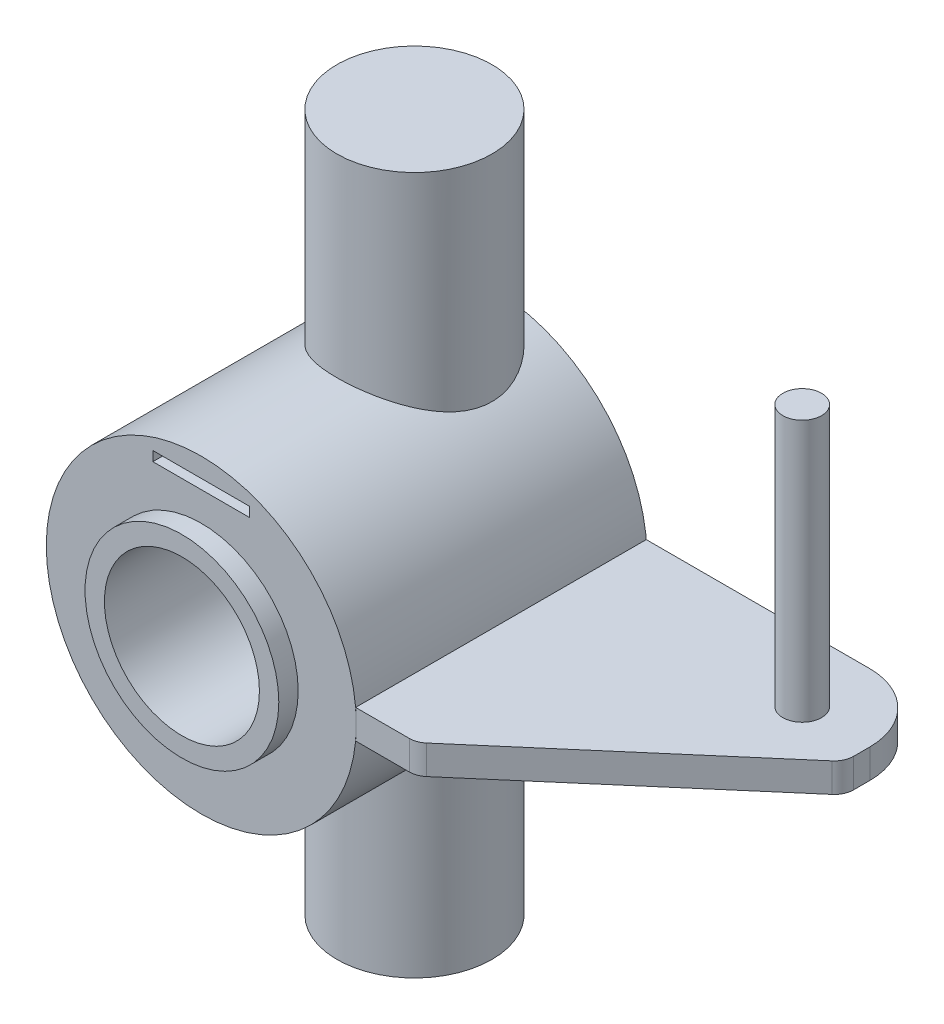
ISO-10303-21;
HEADER;
FILE_DESCRIPTION(('STEP AP214'),'2;1');
FILE_NAME('part.step','',(''),(''),'','','');
FILE_SCHEMA(('AUTOMOTIVE_DESIGN { 1 0 10303 214 1 1 1 1 }'));
ENDSEC;
DATA;
#1=APPLICATION_CONTEXT('core data for automotive mechanical design processes');
#2=APPLICATION_PROTOCOL_DEFINITION('international standard','automotive_design',2000,#1);
#3=PRODUCT_CONTEXT('',#1,'mechanical');
#4=PRODUCT('Part','Part','',(#3));
#5=PRODUCT_RELATED_PRODUCT_CATEGORY('part','',(#4));
#6=PRODUCT_DEFINITION_FORMATION('','',#4);
#7=PRODUCT_DEFINITION_CONTEXT('part definition',#1,'design');
#8=PRODUCT_DEFINITION('design','',#6,#7);
#9=PRODUCT_DEFINITION_SHAPE('','',#8);
#10=(LENGTH_UNIT() NAMED_UNIT(*) SI_UNIT(.MILLI.,.METRE.));
#11=(NAMED_UNIT(*) PLANE_ANGLE_UNIT() SI_UNIT($,.RADIAN.));
#12=(NAMED_UNIT(*) SI_UNIT($,.STERADIAN.) SOLID_ANGLE_UNIT());
#13=UNCERTAINTY_MEASURE_WITH_UNIT(LENGTH_MEASURE(1.E-05),#10,'distance_accuracy_value','');
#14=(GEOMETRIC_REPRESENTATION_CONTEXT(3) GLOBAL_UNCERTAINTY_ASSIGNED_CONTEXT((#13)) GLOBAL_UNIT_ASSIGNED_CONTEXT((#10,
#11,#12)) REPRESENTATION_CONTEXT('',''));
#15=CARTESIAN_POINT('',(0.,0.,0.));
#16=DIRECTION('',(0.,0.,1.));
#17=DIRECTION('',(1.,0.,0.));
#18=AXIS2_PLACEMENT_3D('',#15,#16,#17);
#19=CARTESIAN_POINT('',(23.,0.750000000000004,0.));
#20=DIRECTION('',(0.,-1.,0.));
#21=DIRECTION('',(0.,0.,-1.));
#22=AXIS2_PLACEMENT_3D('',#19,#20,#21);
#23=PLANE('',#22);
#24=CARTESIAN_POINT('',(19.4463189334762,0.750000000000002,3.43499495567666));
#25=DIRECTION('',(0.,-1.,0.));
#26=DIRECTION('',(0.,0.,-1.));
#27=AXIS2_PLACEMENT_3D('',#24,#25,#26);
#28=CIRCLE('',#27,1.);
#29=CARTESIAN_POINT('',(19.4463189334762,0.750000000000003,2.43499495567666));
#30=VERTEX_POINT('',#29);
#31=EDGE_CURVE('E168',#30,#30,#28,.T.);
#32=ORIENTED_EDGE('',*,*,#31,.T.);
#33=EDGE_LOOP('',(#32));
#34=FACE_BOUND('',#33,.T.);
#35=DIRECTION('',(0.758813097039512,0.,-0.651308439805062));
#36=VECTOR('',#35,1.);
#37=CARTESIAN_POINT('',(25.3687248158512,0.750000000000003,2.75970539256084));
#38=LINE('',#37,#36);
#39=CARTESIAN_POINT('',(11.3890501755666,0.749999999999998,14.7588130970395));
#40=VERTEX_POINT('',#39);
#41=CARTESIAN_POINT('',(22.6513084398051,0.750000000000002,5.09213247781868));
#42=VERTEX_POINT('',#41);
#43=EDGE_CURVE('E116',#40,#42,#38,.T.);
#44=ORIENTED_EDGE('',*,*,#43,.T.);
#45=CARTESIAN_POINT('',(22.,0.750000000000002,4.33331938077917));
#46=DIRECTION('',(0.,-1.,0.));
#47=DIRECTION('',(0.,0.,-1.));
#48=AXIS2_PLACEMENT_3D('',#45,#46,#47);
#49=CIRCLE('',#48,1.);
#50=CARTESIAN_POINT('',(23.,0.750000000000002,4.33331938077917));
#51=VERTEX_POINT('',#50);
#52=EDGE_CURVE('E65',#42,#51,#49,.F.);
#53=ORIENTED_EDGE('',*,*,#52,.T.);
#54=DIRECTION('',(0.,0.,1.));
#55=VECTOR('',#54,1.);
#56=CARTESIAN_POINT('',(23.,0.750000000000004,0.));
#57=LINE('',#56,#55);
#58=CARTESIAN_POINT('',(23.,0.750000000000002,3.5));
#59=VERTEX_POINT('',#58);
#60=EDGE_CURVE('E136',#59,#51,#57,.T.);
#61=ORIENTED_EDGE('',*,*,#60,.F.);
#62=CARTESIAN_POINT('',(19.5,0.750000000000002,3.5));
#63=DIRECTION('',(0.,-1.,0.));
#64=DIRECTION('',(0.,0.,-1.));
#65=AXIS2_PLACEMENT_3D('',#62,#63,#64);
#66=CIRCLE('',#65,3.5);
#67=CARTESIAN_POINT('',(19.5,0.750000000000004,0.));
#68=VERTEX_POINT('',#67);
#69=EDGE_CURVE('E125',#68,#59,#66,.T.);
#70=ORIENTED_EDGE('',*,*,#69,.F.);
#71=DIRECTION('',(-1.,0.,0.));
#72=VECTOR('',#71,1.);
#73=CARTESIAN_POINT('',(23.,0.750000000000004,0.));
#74=LINE('',#73,#72);
#75=CARTESIAN_POINT('',(7.964766161037,0.749999999999998,0.));
#76=VERTEX_POINT('',#75);
#77=EDGE_CURVE('E124',#68,#76,#74,.T.);
#78=ORIENTED_EDGE('',*,*,#77,.T.);
#79=DIRECTION('',(0.,0.,-1.));
#80=VECTOR('',#79,1.);
#81=CARTESIAN_POINT('',(7.964766161037,0.749999999999998,15.));
#82=LINE('',#81,#80);
#83=CARTESIAN_POINT('',(7.964766161037,0.749999999999998,15.));
#84=VERTEX_POINT('',#83);
#85=EDGE_CURVE('E175',#76,#84,#82,.F.);
#86=ORIENTED_EDGE('',*,*,#85,.T.);
#87=DIRECTION('',(-1.,0.,0.));
#88=VECTOR('',#87,1.);
#89=CARTESIAN_POINT('',(23.,0.749999999999998,15.));
#90=LINE('',#89,#88);
#91=CARTESIAN_POINT('',(10.7377417357616,0.749999999999998,15.));
#92=VERTEX_POINT('',#91);
#93=EDGE_CURVE('E134',#92,#84,#90,.T.);
#94=ORIENTED_EDGE('',*,*,#93,.F.);
#95=CARTESIAN_POINT('',(10.7377417357616,0.749999999999999,14.));
#96=DIRECTION('',(0.,-1.,0.));
#97=DIRECTION('',(0.,0.,-1.));
#98=AXIS2_PLACEMENT_3D('',#95,#96,#97);
#99=CIRCLE('',#98,1.);
#100=EDGE_CURVE('E150',#92,#40,#99,.F.);
#101=ORIENTED_EDGE('',*,*,#100,.T.);
#102=EDGE_LOOP('',(#44,#53,#61,#70,#78,#86,#94,#101));
#103=FACE_BOUND('',#102,.T.);
#104=ADVANCED_FACE('F43',(#34,#103),#23,.F.);
#105=CARTESIAN_POINT('',(23.,-0.750000000000004,0.));
#106=DIRECTION('',(0.,1.,0.));
#107=DIRECTION('',(0.,0.,1.));
#108=AXIS2_PLACEMENT_3D('',#105,#106,#107);
#109=PLANE('',#108);
#110=DIRECTION('',(0.,0.,-1.));
#111=VECTOR('',#110,1.);
#112=CARTESIAN_POINT('',(23.,-0.750000000000004,0.));
#113=LINE('',#112,#111);
#114=CARTESIAN_POINT('',(23.,-0.750000000000003,4.33331938077917));
#115=VERTEX_POINT('',#114);
#116=CARTESIAN_POINT('',(23.,-0.750000000000003,3.5));
#117=VERTEX_POINT('',#116);
#118=EDGE_CURVE('E132',#115,#117,#113,.T.);
#119=ORIENTED_EDGE('',*,*,#118,.F.);
#120=CARTESIAN_POINT('',(22.,-0.750000000000004,4.33331938077917));
#121=DIRECTION('',(0.,1.,0.));
#122=DIRECTION('',(0.,0.,1.));
#123=AXIS2_PLACEMENT_3D('',#120,#121,#122);
#124=CIRCLE('',#123,1.);
#125=CARTESIAN_POINT('',(22.6513084398051,-0.750000000000003,5.09213247781868));
#126=VERTEX_POINT('',#125);
#127=EDGE_CURVE('E12',#115,#126,#124,.F.);
#128=ORIENTED_EDGE('',*,*,#127,.T.);
#129=DIRECTION('',(0.758813097039512,0.,-0.651308439805062));
#130=VECTOR('',#129,1.);
#131=CARTESIAN_POINT('',(12.1253865423612,-0.750000000000002,14.1267970022992));
#132=LINE('',#131,#130);
#133=CARTESIAN_POINT('',(11.3890501755666,-0.750000000000002,14.7588130970395));
#134=VERTEX_POINT('',#133);
#135=EDGE_CURVE('E162',#134,#126,#132,.T.);
#136=ORIENTED_EDGE('',*,*,#135,.F.);
#137=CARTESIAN_POINT('',(10.7377417357616,-0.750000000000002,14.));
#138=DIRECTION('',(0.,1.,0.));
#139=DIRECTION('',(0.,0.,1.));
#140=AXIS2_PLACEMENT_3D('',#137,#138,#139);
#141=CIRCLE('',#140,1.);
#142=CARTESIAN_POINT('',(10.7377417357616,-0.750000000000002,15.));
#143=VERTEX_POINT('',#142);
#144=EDGE_CURVE('E146',#134,#143,#141,.F.);
#145=ORIENTED_EDGE('',*,*,#144,.T.);
#146=DIRECTION('',(-1.,0.,0.));
#147=VECTOR('',#146,1.);
#148=CARTESIAN_POINT('',(23.,-0.750000000000002,15.));
#149=LINE('',#148,#147);
#150=CARTESIAN_POINT('',(7.964766161037,-0.750000000000002,15.));
#151=VERTEX_POINT('',#150);
#152=EDGE_CURVE('E131',#143,#151,#149,.T.);
#153=ORIENTED_EDGE('',*,*,#152,.T.);
#154=DIRECTION('',(0.,0.,-1.));
#155=VECTOR('',#154,1.);
#156=CARTESIAN_POINT('',(7.96476616103699,-0.750000000000002,15.));
#157=LINE('',#156,#155);
#158=CARTESIAN_POINT('',(7.964766161037,-0.750000000000002,0.));
#159=VERTEX_POINT('',#158);
#160=EDGE_CURVE('E130',#151,#159,#157,.T.);
#161=ORIENTED_EDGE('',*,*,#160,.T.);
#162=DIRECTION('',(-1.,0.,0.));
#163=VECTOR('',#162,1.);
#164=CARTESIAN_POINT('',(23.,-0.750000000000004,0.));
#165=LINE('',#164,#163);
#166=CARTESIAN_POINT('',(19.5,-0.750000000000004,0.));
#167=VERTEX_POINT('',#166);
#168=EDGE_CURVE('E122',#167,#159,#165,.T.);
#169=ORIENTED_EDGE('',*,*,#168,.F.);
#170=CARTESIAN_POINT('',(19.5,-0.750000000000003,3.5));
#171=DIRECTION('',(0.,-1.,0.));
#172=DIRECTION('',(0.,0.,-1.));
#173=AXIS2_PLACEMENT_3D('',#170,#171,#172);
#174=CIRCLE('',#173,3.5);
#175=EDGE_CURVE('E107',#167,#117,#174,.T.);
#176=ORIENTED_EDGE('',*,*,#175,.T.);
#177=EDGE_LOOP('',(#119,#128,#136,#145,#153,#161,#169,#176));
#178=FACE_BOUND('',#177,.T.);
#179=ADVANCED_FACE('F128',(#178),#109,.F.);
#180=CARTESIAN_POINT('',(23.,-0.750000000000004,0.));
#181=DIRECTION('',(0.,0.,1.));
#182=DIRECTION('',(0.,-1.,0.));
#183=AXIS2_PLACEMENT_3D('',#180,#181,#182);
#184=PLANE('',#183);
#185=ORIENTED_EDGE('',*,*,#77,.F.);
#186=DIRECTION('',(0.,-1.,0.));
#187=VECTOR('',#186,1.);
#188=CARTESIAN_POINT('',(19.5,14.25,0.));
#189=LINE('',#188,#187);
#190=EDGE_CURVE('E110',#68,#167,#189,.T.);
#191=ORIENTED_EDGE('',*,*,#190,.T.);
#192=ORIENTED_EDGE('',*,*,#168,.T.);
#193=CARTESIAN_POINT('',(0.,0.,0.));
#194=DIRECTION('',(0.,0.,-1.));
#195=DIRECTION('',(0.,1.,0.));
#196=AXIS2_PLACEMENT_3D('',#193,#194,#195);
#197=CIRCLE('',#196,8.);
#198=EDGE_CURVE('E174',#159,#76,#197,.F.);
#199=ORIENTED_EDGE('',*,*,#198,.T.);
#200=EDGE_LOOP('',(#185,#191,#192,#199));
#201=FACE_BOUND('',#200,.T.);
#202=ADVANCED_FACE('F120',(#201),#184,.F.);
#203=CARTESIAN_POINT('',(23.,-0.750000000000002,15.));
#204=DIRECTION('',(0.,0.,-1.));
#205=DIRECTION('',(-1.,0.,0.));
#206=AXIS2_PLACEMENT_3D('',#203,#204,#205);
#207=PLANE('',#206);
#208=ORIENTED_EDGE('',*,*,#152,.F.);
#209=DIRECTION('',(0.,-1.,0.));
#210=VECTOR('',#209,1.);
#211=CARTESIAN_POINT('',(10.7377417357616,-0.750000000000004,15.));
#212=LINE('',#211,#210);
#213=EDGE_CURVE('E148',#143,#92,#212,.F.);
#214=ORIENTED_EDGE('',*,*,#213,.T.);
#215=ORIENTED_EDGE('',*,*,#93,.T.);
#216=CARTESIAN_POINT('',(0.,0.,15.));
#217=DIRECTION('',(0.,0.,1.));
#218=DIRECTION('',(1.,0.,0.));
#219=AXIS2_PLACEMENT_3D('',#216,#217,#218);
#220=CIRCLE('',#219,8.);
#221=EDGE_CURVE('E178',#84,#151,#220,.F.);
#222=ORIENTED_EDGE('',*,*,#221,.T.);
#223=EDGE_LOOP('',(#208,#214,#215,#222));
#224=FACE_BOUND('',#223,.T.);
#225=ADVANCED_FACE('F186',(#224),#207,.F.);
#226=CARTESIAN_POINT('',(23.,0.,0.));
#227=DIRECTION('',(1.,0.,0.));
#228=DIRECTION('',(0.,0.,-1.));
#229=AXIS2_PLACEMENT_3D('',#226,#227,#228);
#230=PLANE('',#229);
#231=ORIENTED_EDGE('',*,*,#60,.T.);
#232=DIRECTION('',(0.,1.,0.));
#233=VECTOR('',#232,1.);
#234=CARTESIAN_POINT('',(23.,-0.750000000000002,4.33331938077917));
#235=LINE('',#234,#233);
#236=EDGE_CURVE('E51',#51,#115,#235,.F.);
#237=ORIENTED_EDGE('',*,*,#236,.T.);
#238=ORIENTED_EDGE('',*,*,#118,.T.);
#239=DIRECTION('',(0.,-1.,0.));
#240=VECTOR('',#239,1.);
#241=CARTESIAN_POINT('',(23.,14.25,3.5));
#242=LINE('',#241,#240);
#243=EDGE_CURVE('E113',#59,#117,#242,.T.);
#244=ORIENTED_EDGE('',*,*,#243,.F.);
#245=EDGE_LOOP('',(#231,#237,#238,#244));
#246=FACE_BOUND('',#245,.T.);
#247=ADVANCED_FACE('F181',(#246),#230,.T.);
#248=CARTESIAN_POINT('',(0.,0.,15.));
#249=DIRECTION('',(0.,0.,-1.));
#250=DIRECTION('',(-1.,0.,0.));
#251=AXIS2_PLACEMENT_3D('',#248,#249,#250);
#252=CYLINDRICAL_SURFACE('',#251,8.);
#253=ORIENTED_EDGE('',*,*,#198,.F.);
#254=ORIENTED_EDGE('',*,*,#160,.F.);
#255=ORIENTED_EDGE('',*,*,#221,.F.);
#256=ORIENTED_EDGE('',*,*,#85,.F.);
#257=EDGE_LOOP('',(#253,#254,#255,#256));
#258=FACE_BOUND('',#257,.T.);
#259=ADVANCED_FACE('F213',(#258),#252,.F.);
#260=CARTESIAN_POINT('',(19.5,14.25,3.5));
#261=DIRECTION('',(0.,-1.,0.));
#262=DIRECTION('',(0.,0.,-1.));
#263=AXIS2_PLACEMENT_3D('',#260,#261,#262);
#264=CYLINDRICAL_SURFACE('',#263,3.5);
#265=ORIENTED_EDGE('',*,*,#69,.T.);
#266=ORIENTED_EDGE('',*,*,#243,.T.);
#267=ORIENTED_EDGE('',*,*,#175,.F.);
#268=ORIENTED_EDGE('',*,*,#190,.F.);
#269=EDGE_LOOP('',(#265,#266,#267,#268));
#270=FACE_BOUND('',#269,.T.);
#271=ADVANCED_FACE('F109',(#270),#264,.T.);
#272=CARTESIAN_POINT('',(12.1253865423612,14.25,14.1267970022992));
#273=DIRECTION('',(-0.651308439805062,0.,-0.758813097039512));
#274=DIRECTION('',(-0.758813097039512,0.,0.651308439805062));
#275=AXIS2_PLACEMENT_3D('',#272,#273,#274);
#276=PLANE('',#275);
#277=ORIENTED_EDGE('',*,*,#135,.T.);
#278=DIRECTION('',(0.,1.,0.));
#279=VECTOR('',#278,1.);
#280=CARTESIAN_POINT('',(22.6513084398051,0.750000000000003,5.09213247781868));
#281=LINE('',#280,#279);
#282=EDGE_CURVE('E152',#126,#42,#281,.T.);
#283=ORIENTED_EDGE('',*,*,#282,.T.);
#284=ORIENTED_EDGE('',*,*,#43,.F.);
#285=DIRECTION('',(0.,-1.,0.));
#286=VECTOR('',#285,1.);
#287=CARTESIAN_POINT('',(11.3890501755666,14.25,14.7588130970395));
#288=LINE('',#287,#286);
#289=EDGE_CURVE('E143',#40,#134,#288,.T.);
#290=ORIENTED_EDGE('',*,*,#289,.T.);
#291=EDGE_LOOP('',(#277,#283,#284,#290));
#292=FACE_BOUND('',#291,.T.);
#293=ADVANCED_FACE('F159',(#292),#276,.F.);
#294=CARTESIAN_POINT('',(10.7377417357616,14.25,14.));
#295=DIRECTION('',(0.,-1.,0.));
#296=DIRECTION('',(1.,0.,0.));
#297=AXIS2_PLACEMENT_3D('',#294,#295,#296);
#298=CYLINDRICAL_SURFACE('',#297,1.);
#299=ORIENTED_EDGE('',*,*,#100,.F.);
#300=ORIENTED_EDGE('',*,*,#213,.F.);
#301=ORIENTED_EDGE('',*,*,#144,.F.);
#302=ORIENTED_EDGE('',*,*,#289,.F.);
#303=EDGE_LOOP('',(#299,#300,#301,#302));
#304=FACE_BOUND('',#303,.T.);
#305=ADVANCED_FACE('F188',(#304),#298,.T.);
#306=CARTESIAN_POINT('',(22.,14.25,4.33331938077917));
#307=DIRECTION('',(0.,-1.,0.));
#308=DIRECTION('',(0.,0.,-1.));
#309=AXIS2_PLACEMENT_3D('',#306,#307,#308);
#310=CYLINDRICAL_SURFACE('',#309,1.);
#311=ORIENTED_EDGE('',*,*,#127,.F.);
#312=ORIENTED_EDGE('',*,*,#236,.F.);
#313=ORIENTED_EDGE('',*,*,#52,.F.);
#314=ORIENTED_EDGE('',*,*,#282,.F.);
#315=EDGE_LOOP('',(#311,#312,#313,#314));
#316=FACE_BOUND('',#315,.T.);
#317=ADVANCED_FACE('F45',(#316),#310,.T.);
#318=CARTESIAN_POINT('',(19.4463189334762,14.25,3.43499495567666));
#319=DIRECTION('',(0.,-1.,0.));
#320=DIRECTION('',(0.,0.,-1.));
#321=AXIS2_PLACEMENT_3D('',#318,#319,#320);
#322=CYLINDRICAL_SURFACE('',#321,1.);
#323=CARTESIAN_POINT('',(19.4463189334762,14.25,3.43499495567666));
#324=DIRECTION('',(0.,-1.,0.));
#325=DIRECTION('',(0.,0.,-1.));
#326=AXIS2_PLACEMENT_3D('',#323,#324,#325);
#327=CIRCLE('',#326,1.);
#328=CARTESIAN_POINT('',(19.4463189334762,14.25,2.43499495567665));
#329=VERTEX_POINT('',#328);
#330=EDGE_CURVE('E233',#329,#329,#327,.T.);
#331=ORIENTED_EDGE('',*,*,#330,.T.);
#332=EDGE_LOOP('',(#331));
#333=FACE_BOUND('',#332,.T.);
#334=ORIENTED_EDGE('',*,*,#31,.F.);
#335=EDGE_LOOP('',(#334));
#336=FACE_BOUND('',#335,.T.);
#337=ADVANCED_FACE('F194',(#333,#336),#322,.T.);
#338=CARTESIAN_POINT('',(19.4463189334762,14.25,3.43499495567666));
#339=DIRECTION('',(0.,-1.,0.));
#340=DIRECTION('',(0.,0.,-1.));
#341=AXIS2_PLACEMENT_3D('',#338,#339,#340);
#342=PLANE('',#341);
#343=ORIENTED_EDGE('',*,*,#330,.F.);
#344=EDGE_LOOP('',(#343));
#345=FACE_BOUND('',#344,.T.);
#346=ADVANCED_FACE('F225',(#345),#342,.F.);
#347=CLOSED_SHELL('',(#104,#179,#202,#225,#247,#259,#271,#293,#305,#317,#337,#346));
#348=MANIFOLD_SOLID_BREP('B2',#347);
#349=CARTESIAN_POINT('',(0.,18.,4.));
#350=DIRECTION('',(0.,-1.,0.));
#351=DIRECTION('',(0.,0.,-1.));
#352=AXIS2_PLACEMENT_3D('',#349,#350,#351);
#353=CYLINDRICAL_SURFACE('',#352,4.);
#354=CARTESIAN_POINT('',(0.,18.,4.));
#355=DIRECTION('',(0.,1.,0.));
#356=DIRECTION('',(0.,0.,1.));
#357=AXIS2_PLACEMENT_3D('',#354,#355,#356);
#358=CIRCLE('',#357,4.);
#359=CARTESIAN_POINT('',(0.,18.,8.));
#360=VERTEX_POINT('',#359);
#361=EDGE_CURVE('E42',#360,#360,#358,.T.);
#362=ORIENTED_EDGE('',*,*,#361,.F.);
#363=EDGE_LOOP('',(#362));
#364=FACE_BOUND('',#363,.T.);
#365=CARTESIAN_POINT('',(0.,8.,8.));
#366=CARTESIAN_POINT('',(0.105191216468488,7.99999964432188,7.99999959515221));
#367=CARTESIAN_POINT('',(0.210389995368427,7.99792027620652,7.99584554268467));
#368=CARTESIAN_POINT('',(0.420011249701336,7.98965597150982,7.97927792190077));
#369=CARTESIAN_POINT('',(0.524433367425618,7.98346924887743,7.96686076043045));
#370=CARTESIAN_POINT('',(0.731828138370605,7.96713597659603,7.93388648530473));
#371=CARTESIAN_POINT('',(0.834798506711917,7.95698378017499,7.9133177633431));
#372=CARTESIAN_POINT('',(1.0384152051955,7.93298382243633,7.86428279244356));
#373=CARTESIAN_POINT('',(1.1390605669938,7.91913455043164,7.83581331493588));
#374=CARTESIAN_POINT('',(1.43561775388138,7.87265974292142,7.73925176888222));
#375=CARTESIAN_POINT('',(1.6271962065847,7.83501976471674,7.65983701915264));
#376=CARTESIAN_POINT('',(1.99392146995421,7.74982886318845,7.47371095891235));
#377=CARTESIAN_POINT('',(2.16906957469774,7.70227872135526,7.36700180061893));
#378=CARTESIAN_POINT('',(2.51002321260362,7.59825056785886,7.12193017740055));
#379=CARTESIAN_POINT('',(2.67462250306452,7.54140647262265,6.98204331180567));
#380=CARTESIAN_POINT('',(2.97911611963431,7.42640030348014,6.67792486241435));
#381=CARTESIAN_POINT('',(3.11899161990724,7.3682372629647,6.51367490095672));
#382=CARTESIAN_POINT('',(3.38102385527715,7.25195135134797,6.15002101287013));
#383=CARTESIAN_POINT('',(3.50096528772936,7.19418138823907,5.94887869572524));
#384=CARTESIAN_POINT('',(3.65378721735264,7.11709930290977,5.63206546004573));
#385=CARTESIAN_POINT('',(3.70022392693971,7.09299422837207,5.5239053371934));
#386=CARTESIAN_POINT('',(3.78359067078057,7.04887690211806,5.30319902892111));
#387=CARTESIAN_POINT('',(3.82052633371565,7.02886222858683,5.19065548607789));
#388=CARTESIAN_POINT('',(3.88251046204454,6.9948044998643,4.96880578069376));
#389=CARTESIAN_POINT('',(3.9081340887804,6.9804776446802,4.85970358083543));
#390=CARTESIAN_POINT('',(3.95018060072941,6.95677065788593,4.63925947717983));
#391=CARTESIAN_POINT('',(3.96660836750271,6.9473879018896,4.52791879424739));
#392=CARTESIAN_POINT('',(3.99001913809428,6.93396933490057,4.30399390653389));
#393=CARTESIAN_POINT('',(3.99700782997252,6.92993030376772,4.19141049191159));
#394=CARTESIAN_POINT('',(4.00144340059851,6.92737022415464,3.96599952196127));
#395=CARTESIAN_POINT('',(3.99889118971828,6.92884864921082,3.853171990953));
#396=CARTESIAN_POINT('',(3.98516575152016,6.93675038555112,3.64183562155368));
#397=CARTESIAN_POINT('',(3.97506329407581,6.94255931040713,3.54323256042783));
#398=CARTESIAN_POINT('',(3.94763759493625,6.95818925294571,3.34734838783369));
#399=CARTESIAN_POINT('',(3.93031208534669,6.96801153072177,3.2500677014795));
#400=CARTESIAN_POINT('',(3.86777248849784,7.00304835203764,2.96122086709978));
#401=CARTESIAN_POINT('',(3.81198555026409,7.03383903740602,2.77250454291879));
#402=CARTESIAN_POINT('',(3.67283599572519,7.10749917506982,2.4030536672292));
#403=CARTESIAN_POINT('',(3.58886132884632,7.15063327143764,2.22260742465183));
#404=CARTESIAN_POINT('',(3.39616568981264,7.2441365265382,1.87746981298511));
#405=CARTESIAN_POINT('',(3.28743360222607,7.29450893132236,1.71278556793507));
#406=CARTESIAN_POINT('',(3.03227252755196,7.40452458073482,1.38191711829539));
#407=CARTESIAN_POINT('',(2.88281182497071,7.46453347888883,1.21819042929159));
#408=CARTESIAN_POINT('',(2.55818830727484,7.58191186589975,0.917040393499512));
#409=CARTESIAN_POINT('',(2.38301327894514,7.63928008344308,0.779629617525468));
#410=CARTESIAN_POINT('',(2.09944472683198,7.7202760768617,0.593246969785754));
#411=CARTESIAN_POINT('',(1.9989679987013,7.74696304862188,0.533318240246936));
#412=CARTESIAN_POINT('',(1.79256850112001,7.79730441532266,0.42223352122335));
#413=CARTESIAN_POINT('',(1.68664805204876,7.82096008757468,0.37107383360208));
#414=CARTESIAN_POINT('',(1.47010242051538,7.86454042959534,0.278080877627199));
#415=CARTESIAN_POINT('',(1.35947915341347,7.88446660078232,0.236243854867457));
#416=CARTESIAN_POINT('',(1.13432950721217,7.91999221203723,0.162380061448199));
#417=CARTESIAN_POINT('',(1.01980357880328,7.9355921498224,0.130352162240849));
#418=CARTESIAN_POINT('',(0.797438403015335,7.96087677585623,0.0787731521448827));
#419=CARTESIAN_POINT('',(0.68983090685457,7.9709443603734,0.058408402943018));
#420=CARTESIAN_POINT('',(0.472998720376382,7.98674429615844,0.0265535517575012));
#421=CARTESIAN_POINT('',(0.363774173887724,7.99247703065614,0.0150626652629393));
#422=CARTESIAN_POINT('',(0.144648447401173,7.99944300548302,0.00110952845549016));
#423=CARTESIAN_POINT('',(0.0347475425961453,8.00067796839692,-0.00135617837901456));
#424=CARTESIAN_POINT('',(-0.184837638972486,7.99861804620746,0.00276424211008771));
#425=CARTESIAN_POINT('',(-0.294521925108021,7.99532336157662,0.00934996883659231));
#426=CARTESIAN_POINT('',(-0.504259611746538,7.98472734940324,0.0306235695271645));
#427=CARTESIAN_POINT('',(-0.604398259266984,7.97775776257091,0.0446410691044307));
#428=CARTESIAN_POINT('',(-0.803035609307668,7.96021983565123,0.0801363996639103));
#429=CARTESIAN_POINT('',(-0.901533743070587,7.94965027363514,0.101616763793442));
#430=CARTESIAN_POINT('',(-1.19351737727532,7.91289127905722,0.176935173599938));
#431=CARTESIAN_POINT('',(-1.38368108667204,7.88164133135127,0.241670140590663));
#432=CARTESIAN_POINT('',(-1.75558493783058,7.80736894774679,0.399998108905637));
#433=CARTESIAN_POINT('',(-1.93692876519228,7.76403545540105,0.494363309171963));
#434=CARTESIAN_POINT('',(-2.28183826656572,7.66975878800211,0.708431034259749));
#435=CARTESIAN_POINT('',(-2.44539632212196,7.61881237399843,0.828144352631561));
#436=CARTESIAN_POINT('',(-2.76706877708067,7.50833088367007,1.10303311970347));
#437=CARTESIAN_POINT('',(-2.92307134240145,7.44844369061623,1.26053653725913));
#438=CARTESIAN_POINT('',(-3.20744226426287,7.33048735856255,1.5997355652547));
#439=CARTESIAN_POINT('',(-3.33579150415337,7.27241950081065,1.7814477716031));
#440=CARTESIAN_POINT('',(-3.50772930633183,7.19028164087441,2.0739940144221));
#441=CARTESIAN_POINT('',(-3.5626157867948,7.16316684054651,2.17748375843627));
#442=CARTESIAN_POINT('',(-3.66334616154282,7.11217812644117,2.38951843531651));
#443=CARTESIAN_POINT('',(-3.70919441458265,7.08830265221425,2.49806090009515));
#444=CARTESIAN_POINT('',(-3.79131200961919,7.04472262103751,2.71942164536428));
#445=CARTESIAN_POINT('',(-3.82758904080802,7.02501471854545,2.83223640979536));
#446=CARTESIAN_POINT('',(-3.89012004539429,6.9905825381999,3.06135278907153));
#447=CARTESIAN_POINT('',(-3.91637557070638,6.97585748874971,3.17765386102154));
#448=CARTESIAN_POINT('',(-3.95643062416587,6.95321025619991,3.40141213316309));
#449=CARTESIAN_POINT('',(-3.97118378192521,6.94477079792059,3.50864683290839));
#450=CARTESIAN_POINT('',(-3.99195118317071,6.93285441469714,3.72422767020064));
#451=CARTESIAN_POINT('',(-3.99796634225491,6.92937696981658,3.8325736901013));
#452=CARTESIAN_POINT('',(-4.00116308319383,6.92753208063799,4.04940749673038));
#453=CARTESIAN_POINT('',(-3.99834777004019,6.9291628401807,4.15789522022328));
#454=CARTESIAN_POINT('',(-3.98394653809981,6.9374509348198,4.37406114711354));
#455=CARTESIAN_POINT('',(-3.97236097836303,6.94410806413885,4.48173938346867));
#456=CARTESIAN_POINT('',(-3.92770249100378,6.96952879582861,4.7818001370413));
#457=CARTESIAN_POINT('',(-3.88483285002042,6.99372760142387,4.97236586731381));
#458=CARTESIAN_POINT('',(-3.77270184038046,7.05483682415845,5.34326850255324));
#459=CARTESIAN_POINT('',(-3.70343198216887,7.09175132993569,5.52360209570391));
#460=CARTESIAN_POINT('',(-3.53526338936952,7.17714225279385,5.882488553514));
#461=CARTESIAN_POINT('',(-3.43468670285354,7.22622883383996,6.06010777576172));
#462=CARTESIAN_POINT('',(-3.20860173383709,7.3294133274236,6.39710197827703));
#463=CARTESIAN_POINT('',(-3.08308048046464,7.38351383930109,6.55646739854074));
#464=CARTESIAN_POINT('',(-2.79282250805389,7.49849148240842,6.8725629090385));
#465=CARTESIAN_POINT('',(-2.62517402605099,7.55939328373464,7.02661992962373));
#466=CARTESIAN_POINT('',(-2.26458287075638,7.67511613929542,7.3050684228129));
#467=CARTESIAN_POINT('',(-2.07162664990559,7.72993390744395,7.42944390524207));
#468=CARTESIAN_POINT('',(-1.76603106757846,7.80335210517359,7.59090424941519));
#469=CARTESIAN_POINT('',(-1.66100410373827,7.82643367929072,7.64069364140905));
#470=CARTESIAN_POINT('',(-1.44639623629744,7.8689179624278,7.73114894700146));
#471=CARTESIAN_POINT('',(-1.33681760142932,7.88832247803741,7.77181934269804));
#472=CARTESIAN_POINT('',(-1.11415600876093,7.92283587265691,7.84347634443401));
#473=CARTESIAN_POINT('',(-1.00108129646084,7.93795411409434,7.87448407138671));
#474=CARTESIAN_POINT('',(-0.772189766950842,7.96347694583626,7.92651008001648));
#475=CARTESIAN_POINT('',(-0.656374670304615,7.97388441530454,7.94753446377235));
#476=CARTESIAN_POINT('',(-0.450433316283305,7.98781110043795,7.97557962119869));
#477=CARTESIAN_POINT('',(-0.360660623567813,7.99237392421376,7.98472938917604));
#478=CARTESIAN_POINT('',(-0.180593821057088,7.99846856848791,7.99693983637807));
#479=CARTESIAN_POINT('',(-0.0902996969389666,8.00000030532612,8.00000034753503));
#480=CARTESIAN_POINT('',(0.,8.,8.));
#481=B_SPLINE_CURVE_WITH_KNOTS('',3,(#365,#366,#367,#368,#369,#370,#371,#372,#373,#374,#375,
#376,#377,#378,#379,#380,#381,#382,#383,#384,#385,#386,#387,#388,#389,#390,#391,#392,#393,#394,
#395,#396,#397,#398,#399,#400,#401,#402,#403,#404,#405,#406,#407,#408,#409,#410,#411,#412,#413,
#414,#415,#416,#417,#418,#419,#420,#421,#422,#423,#424,#425,#426,#427,#428,#429,#430,#431,#432,
#433,#434,#435,#436,#437,#438,#439,#440,#441,#442,#443,#444,#445,#446,#447,#448,#449,#450,#451,
#452,#453,#454,#455,#456,#457,#458,#459,#460,#461,#462,#463,#464,#465,#466,#467,#468,#469,#470,
#471,#472,#473,#474,#475,#476,#477,#478,#479,#480),.UNSPECIFIED.,.T.,.F.,(4,2,2,2,2,2,2,2,2,2,2,
2,2,2,2,2,2,2,2,2,2,2,2,2,2,2,2,2,2,2,2,2,2,2,2,2,2,2,2,2,2,2,2,2,2,2,2,2,2,2,2,2,2,2,2,2,2,4),
(0.,0.315484235719912,0.631105747230253,0.947178346952276,1.26338029745354,1.89263632058595,
2.52184274094302,3.18911473348911,3.85689264923289,4.57645675584686,4.93648208726456,
5.29629363598333,5.63476191634051,5.97305035229576,6.31113484191767,6.64918707308226,
6.94669148652859,7.24428938086225,7.83905304157541,8.44767049128776,9.05656173495714,
9.74265853790341,10.4290822684957,10.7886699173095,11.1481055433964,11.5073961555811,
11.8666454155399,12.1961419049363,12.5256092612256,12.8549504227676,13.184277008843,
13.4879760335491,13.791778244799,14.3988188497914,15.02321622567,15.6478800144877,
16.33388641032,17.0203655291613,17.380682030865,17.7408243397693,18.1006764355618,
18.4604727825931,18.7857371805984,19.1109674938045,19.4360834615763,19.7611861199664,
20.3488209353335,20.9366448769134,21.5639619965908,22.1916061711245,22.8955134356508,
23.5997990605888,23.9548906509477,24.3098073249809,24.6639426811876,25.0178613011449,
25.2886761616556,25.5594984967416),.UNSPECIFIED.);
#482=CARTESIAN_POINT('',(0.,8.,8.));
#483=VERTEX_POINT('',#482);
#484=EDGE_CURVE('E318',#483,#483,#481,.T.);
#485=ORIENTED_EDGE('',*,*,#484,.T.);
#486=EDGE_LOOP('',(#485));
#487=FACE_BOUND('',#486,.T.);
#488=ADVANCED_FACE('F312',(#364,#487),#353,.T.);
#489=CARTESIAN_POINT('',(0.,18.,4.));
#490=DIRECTION('',(0.,1.,0.));
#491=DIRECTION('',(0.,0.,1.));
#492=AXIS2_PLACEMENT_3D('',#489,#490,#491);
#493=PLANE('',#492);
#494=ORIENTED_EDGE('',*,*,#361,.T.);
#495=EDGE_LOOP('',(#494));
#496=FACE_BOUND('',#495,.T.);
#497=ADVANCED_FACE('F333',(#496),#493,.T.);
#498=CARTESIAN_POINT('',(0.,0.,15.));
#499=DIRECTION('',(0.,0.,-1.));
#500=DIRECTION('',(-1.,0.,0.));
#501=AXIS2_PLACEMENT_3D('',#498,#499,#500);
#502=CYLINDRICAL_SURFACE('',#501,8.);
#503=ORIENTED_EDGE('',*,*,#484,.F.);
#504=EDGE_LOOP('',(#503));
#505=FACE_BOUND('',#504,.T.);
#506=ADVANCED_FACE('F330',(#505),#502,.F.);
#507=CLOSED_SHELL('',(#488,#497,#506));
#508=MANIFOLD_SOLID_BREP('B6',#507);
#509=CARTESIAN_POINT('',(0.,0.,15.));
#510=DIRECTION('',(0.,0.,-1.));
#511=DIRECTION('',(-1.,0.,0.));
#512=AXIS2_PLACEMENT_3D('',#509,#510,#511);
#513=CYLINDRICAL_SURFACE('',#512,8.);
#514=CARTESIAN_POINT('',(0.,0.,15.));
#515=DIRECTION('',(0.,0.,1.));
#516=DIRECTION('',(1.,0.,0.));
#517=AXIS2_PLACEMENT_3D('',#514,#515,#516);
#518=CIRCLE('',#517,8.);
#519=CARTESIAN_POINT('',(8.,0.,15.));
#520=VERTEX_POINT('',#519);
#521=EDGE_CURVE('E310',#520,#520,#518,.T.);
#522=ORIENTED_EDGE('',*,*,#521,.F.);
#523=EDGE_LOOP('',(#522));
#524=FACE_BOUND('',#523,.T.);
#525=CARTESIAN_POINT('',(0.,0.,0.));
#526=DIRECTION('',(0.,0.,1.));
#527=DIRECTION('',(1.,0.,0.));
#528=AXIS2_PLACEMENT_3D('',#525,#526,#527);
#529=CIRCLE('',#528,8.);
#530=CARTESIAN_POINT('',(0.,-8.,0.));
#531=VERTEX_POINT('',#530);
#532=EDGE_CURVE('E364',#531,#531,#529,.T.);
#533=ORIENTED_EDGE('',*,*,#532,.T.);
#534=CARTESIAN_POINT('',(4.00000000000001,-6.9282032302755,4.));
#535=CARTESIAN_POINT('',(3.99999950219345,-6.92820386262826,4.1042653254373));
#536=CARTESIAN_POINT('',(3.9959176319954,-6.93056511456488,4.20853992667939));
#537=CARTESIAN_POINT('',(3.97964472112407,-6.93992172463862,4.41628417460038));
#538=CARTESIAN_POINT('',(3.96744990521399,-6.94691924018481,4.51975342383269));
#539=CARTESIAN_POINT('',(3.93508538297522,-6.96530330045203,4.72521084556988));
#540=CARTESIAN_POINT('',(3.91490316893164,-6.97669672816262,4.82719643382953));
#541=CARTESIAN_POINT('',(3.86682062971259,-7.00345973447504,5.02881400167829));
#542=CARTESIAN_POINT('',(3.83891695064122,-7.01883104071991,5.12844493804267));
#543=CARTESIAN_POINT('',(3.74442772916635,-7.06996541785761,5.42168896600919));
#544=CARTESIAN_POINT('',(3.66684915651286,-7.11087904783325,5.61098585661696));
#545=CARTESIAN_POINT('',(3.4850607538011,-7.20170927952067,5.97372956380103));
#546=CARTESIAN_POINT('',(3.38084948302617,-7.25162636823861,6.14717552221941));
#547=CARTESIAN_POINT('',(3.13867639492106,-7.3598722626408,6.48920849434794));
#548=CARTESIAN_POINT('',(2.99863981046009,-7.41855528289904,6.65621486644762));
#549=CARTESIAN_POINT('',(2.69298354883076,-7.53488657765781,6.96565524064934));
#550=CARTESIAN_POINT('',(2.52735118809494,-7.59253432325008,7.10807698576393));
#551=CARTESIAN_POINT('',(2.25626437810993,-7.6758759355965,7.30498206648215));
#552=CARTESIAN_POINT('',(2.15870290429516,-7.70394919240218,7.36953226161913));
#553=CARTESIAN_POINT('',(1.95777427065883,-7.75744193796062,7.49010444022811));
#554=CARTESIAN_POINT('',(1.85440960246324,-7.78286255243594,7.54613004600924));
#555=CARTESIAN_POINT('',(1.64251485422607,-7.83032159918279,7.64911278165759));
#556=CARTESIAN_POINT('',(1.53398485456802,-7.85236008406491,7.6960700525899));
#557=CARTESIAN_POINT('',(1.3125858096749,-7.89238619731919,7.78036194826573));
#558=CARTESIAN_POINT('',(1.19971924732416,-7.91037610439248,7.81770198768932));
#559=CARTESIAN_POINT('',(0.978622575683248,-7.94064573590697,7.88001829427466));
#560=CARTESIAN_POINT('',(0.870629018183695,-7.95323930006917,7.90568215305844));
#561=CARTESIAN_POINT('',(0.652524088435726,-7.97409583861317,7.94797970743347));
#562=CARTESIAN_POINT('',(0.542413779814414,-7.98236093189931,7.96461782151572));
#563=CARTESIAN_POINT('',(0.320973525125338,-7.99432715952591,7.98865586699747));
#564=CARTESIAN_POINT('',(0.209643937931229,-7.99802960221736,7.99605844671614));
#565=CARTESIAN_POINT('',(-0.0132971447801722,-8.0007656004484,8.00153168636999));
#566=CARTESIAN_POINT('',(-0.124908622632314,-7.99979944163708,7.99960291724515));
#567=CARTESIAN_POINT('',(-0.337727985342423,-7.99351360464185,7.98701479129273));
#568=CARTESIAN_POINT('',(-0.438993817716938,-7.98858118408677,7.97713197765086));
#569=CARTESIAN_POINT('',(-0.640243249291353,-7.97497880011988,7.94973672090394));
#570=CARTESIAN_POINT('',(-0.740226424897065,-7.96630763313356,7.93222182086393));
#571=CARTESIAN_POINT('',(-1.03714138295469,-7.93497195498556,7.86848947730556));
#572=CARTESIAN_POINT('',(-1.23123936013571,-7.9069787607081,7.81107210299894));
#573=CARTESIAN_POINT('',(-1.6092687156014,-7.83886272517952,7.6676660261144));
#574=CARTESIAN_POINT('',(-1.79302228049015,-7.79857742343273,7.58129301759658));
#575=CARTESIAN_POINT('',(-2.14389861654609,-7.70950607728793,7.38294806552919));
#576=CARTESIAN_POINT('',(-2.31101540282593,-7.66071699099023,7.27096695718556));
#577=CARTESIAN_POINT('',(-2.64069813790284,-7.55377539869557,7.01241508000272));
#578=CARTESIAN_POINT('',(-2.80134064782814,-7.49517374441381,6.86357523984661));
#579=CARTESIAN_POINT('',(-3.096413130151,-7.37817491997775,6.54165375681343));
#580=CARTESIAN_POINT('',(-3.23082293513642,-7.31977794078033,6.36855363717567));
#581=CARTESIAN_POINT('',(-3.47803613314163,-7.20576112808083,5.98935711133187));
#582=CARTESIAN_POINT('',(-3.58892539602577,-7.15055315383099,5.78186338145237));
#583=CARTESIAN_POINT('',(-3.72723782010754,-7.07886925416584,5.45658261556123));
#584=CARTESIAN_POINT('',(-3.76867730715225,-7.05682593849463,5.34579164080266));
#585=CARTESIAN_POINT('',(-3.84175062064906,-7.01731299636541,5.12025515321879));
#586=CARTESIAN_POINT('',(-3.87339049322799,-6.99984055082838,5.00551212747387));
#587=CARTESIAN_POINT('',(-3.92431909326376,-6.97140602598867,4.78217133548265));
#588=CARTESIAN_POINT('',(-3.94438433855718,-6.96003957007805,4.67380134853994));
#589=CARTESIAN_POINT('',(-3.97551851361913,-6.94230335544128,4.45541909952217));
#590=CARTESIAN_POINT('',(-3.98659212183613,-6.93593099829036,4.34540772186559));
#591=CARTESIAN_POINT('',(-3.99958291311108,-6.92844811909925,4.12470748996731));
#592=CARTESIAN_POINT('',(-4.00150350567567,-6.92733563775176,4.01401890337321));
#593=CARTESIAN_POINT('',(-3.99616718095744,-6.93041539174955,3.79294330689436));
#594=CARTESIAN_POINT('',(-3.98891088315149,-6.93460726902939,3.68255627715739));
#595=CARTESIAN_POINT('',(-3.96663154579714,-6.94737197203376,3.47513061602036));
#596=CARTESIAN_POINT('',(-3.95254845698989,-6.95541341326253,3.3779567889877));
#597=CARTESIAN_POINT('',(-3.91737385475212,-6.97528372672039,3.18526806656622));
#598=CARTESIAN_POINT('',(-3.89628002700134,-6.98711384958699,3.08975372996381));
#599=CARTESIAN_POINT('',(-3.82280238446313,-7.02775685901555,2.80663196389194));
#600=CARTESIAN_POINT('',(-3.76020731695077,-7.06173163693377,2.62230856572734));
#601=CARTESIAN_POINT('',(-3.60658595732554,-7.14144993292041,2.25832541229841));
#602=CARTESIAN_POINT('',(-3.51437713951607,-7.18766564346826,2.07927704666103));
#603=CARTESIAN_POINT('',(-3.30514737086267,-7.28624486618866,1.73812980331287));
#604=CARTESIAN_POINT('',(-3.18811367399407,-7.33861153030439,1.57603969669191));
#605=CARTESIAN_POINT('',(-2.91535761342628,-7.45151836616993,1.25208687714178));
#606=CARTESIAN_POINT('',(-2.75661800037809,-7.51225675092662,1.09282841283409));
#607=CARTESIAN_POINT('',(-2.41358105803055,-7.62937597657745,0.802334026584154));
#608=CARTESIAN_POINT('',(-2.22927513013699,-7.68575534144676,0.671107570383756));
#609=CARTESIAN_POINT('',(-1.93419225408146,-7.76335543938379,0.496792217762809));
#610=CARTESIAN_POINT('',(-1.83122945254024,-7.78834354202674,0.441869942701289));
#611=CARTESIAN_POINT('',(-1.62028527572798,-7.83494183925331,0.34099446912297));
#612=CARTESIAN_POINT('',(-1.51230618469743,-7.85655355213899,0.295037236861767));
#613=CARTESIAN_POINT('',(-1.29213403393068,-7.89575152015211,0.212625673359868));
#614=CARTESIAN_POINT('',(-1.17994299872754,-7.91333968113673,0.176166841820374));
#615=CARTESIAN_POINT('',(-0.952197786601979,-7.94396070933363,0.113192739054084));
#616=CARTESIAN_POINT('',(-0.836644010238124,-7.95699411670659,0.0866762887059286));
#617=CARTESIAN_POINT('',(-0.613942900584693,-7.97711749125789,0.0459279500527829));
#618=CARTESIAN_POINT('',(-0.506999857370266,-7.98464383966398,0.0307905272241886));
#619=CARTESIAN_POINT('',(-0.291983714868724,-7.99539449729097,0.00920788664752355));
#620=CARTESIAN_POINT('',(-0.183910251308576,-7.99861737381754,0.00276556362899211));
#621=CARTESIAN_POINT('',(0.03236920279163,-8.00066496370437,-0.00133014208550515));
#622=CARTESIAN_POINT('',(0.140575049615288,-7.99949272302419,0.00101038841557485));
#623=CARTESIAN_POINT('',(0.356345776551111,-7.99278884324615,0.0144376708259707));
#624=CARTESIAN_POINT('',(0.463910407218418,-7.9872556066098,0.0255276278637623));
#625=CARTESIAN_POINT('',(0.670402230454413,-7.97248705040341,0.0552939773904399));
#626=CARTESIAN_POINT('',(0.769428771379719,-7.96352188946078,0.0734178487040997));
#627=CARTESIAN_POINT('',(0.96549401655823,-7.94213883037982,0.116969937488292));
#628=CARTESIAN_POINT('',(1.06253202988244,-7.92971975328176,0.142400649174037));
#629=CARTESIAN_POINT('',(1.34967669515382,-7.88769036296796,0.229286595750671));
#630=CARTESIAN_POINT('',(1.535990515319,-7.85329454083082,0.301361540160017));
#631=CARTESIAN_POINT('',(1.90172389087137,-7.77303546188782,0.474913777280617));
#632=CARTESIAN_POINT('',(2.08050775123498,-7.72674465907378,0.577516772333945));
#633=CARTESIAN_POINT('',(2.41909138351715,-7.62752535456451,0.80783224417312));
#634=CARTESIAN_POINT('',(2.57888238184509,-7.57459380826236,0.935556253632443));
#635=CARTESIAN_POINT('',(2.8916543099683,-7.46114622775076,1.22718013687798));
#636=CARTESIAN_POINT('',(3.04237488708293,-7.40039963213063,1.39341522683605));
#637=CARTESIAN_POINT('',(3.31466901461284,-7.28251536809497,1.74983763817227));
#638=CARTESIAN_POINT('',(3.43621677845464,-7.22538092516391,1.94004592524942));
#639=CARTESIAN_POINT('',(3.59554085555899,-7.14673032771597,2.24337573615295));
#640=CARTESIAN_POINT('',(3.64540546855455,-7.12134958638073,2.34930106826833));
#641=CARTESIAN_POINT('',(3.7358834166029,-7.07430377646636,2.56580437696515));
#642=CARTESIAN_POINT('',(3.77650151690077,-7.05263679540785,2.67637992206191));
#643=CARTESIAN_POINT('',(3.84790167044831,-7.01393620687008,2.90112629943264));
#644=CARTESIAN_POINT('',(3.87870902746066,-6.99689069691894,3.01528703446802));
#645=CARTESIAN_POINT('',(3.93016568856618,-6.96811827819219,3.24647371557682));
#646=CARTESIAN_POINT('',(3.95082209480825,-6.95638765128934,3.36349759808763));
#647=CARTESIAN_POINT('',(3.97745846425998,-6.94118032889089,3.56719830954344));
#648=CARTESIAN_POINT('',(3.98590343866334,-6.93632575562013,3.6534593729815));
#649=CARTESIAN_POINT('',(3.99717460159989,-6.92983683549392,3.82647812798563));
#650=CARTESIAN_POINT('',(4.00000041424857,-6.92820270406463,3.91323585238573));
#651=CARTESIAN_POINT('',(4.00000000000001,-6.9282032302755,4.));
#652=B_SPLINE_CURVE_WITH_KNOTS('',3,(#534,#535,#536,#537,#538,#539,#540,#541,#542,#543,#544,
#545,#546,#547,#548,#549,#550,#551,#552,#553,#554,#555,#556,#557,#558,#559,#560,#561,#562,#563,
#564,#565,#566,#567,#568,#569,#570,#571,#572,#573,#574,#575,#576,#577,#578,#579,#580,#581,#582,
#583,#584,#585,#586,#587,#588,#589,#590,#591,#592,#593,#594,#595,#596,#597,#598,#599,#600,#601,
#602,#603,#604,#605,#606,#607,#608,#609,#610,#611,#612,#613,#614,#615,#616,#617,#618,#619,#620,
#621,#622,#623,#624,#625,#626,#627,#628,#629,#630,#631,#632,#633,#634,#635,#636,#637,#638,#639,
#640,#641,#642,#643,#644,#645,#646,#647,#648,#649,#650,#651),.UNSPECIFIED.,.T.,.F.,(4,2,2,2,2,2,
2,2,2,2,2,2,2,2,2,2,2,2,2,2,2,2,2,2,2,2,2,2,2,2,2,2,2,2,2,2,2,2,2,2,2,2,2,2,2,2,2,2,2,2,2,2,2,2,
2,2,2,2,4),(0.,0.312705907645188,0.625557430139016,0.93890080736969,1.25238050266336,
1.87532331508721,2.49829983322606,3.1726581814384,3.8473517748203,4.20786878872691,
4.56823217961299,4.92858996431118,5.28874441516655,5.62343001077676,5.95795161516748,
6.29237727234833,6.62678246790366,6.93200651230821,7.23732888766059,7.84737748897727,
8.46586637752493,9.08457696228994,9.76177264655468,10.4394869181158,11.160238657457,
11.5207615871968,11.8810616378014,12.212984058814,12.5447336660446,12.8763596865808,
13.2079633222266,13.5031682056198,13.7984706362685,14.38866539675,15.006195155551,
15.6240427481094,16.319773042532,17.0157378984356,17.3733524504477,17.7308057238246,
18.0880893282017,18.4453305469501,18.7697157004162,19.0942088199644,19.4184770967801,
19.7428642161659,20.0457160884446,20.3486714633268,20.9540518089476,21.585324497246,
22.2168876724958,22.9113041424698,23.6063321822733,23.9652997079033,24.3240818165632,
24.6819309195696,25.0395292944428,25.2997293817866,25.5599468741983),.UNSPECIFIED.);
#653=EDGE_CURVE('E437',#531,#531,#652,.T.);
#654=ORIENTED_EDGE('',*,*,#653,.F.);
#655=EDGE_LOOP('',(#533,#654));
#656=FACE_BOUND('',#655,.T.);
#657=ADVANCED_FACE('F361',(#524,#656),#513,.T.);
#658=CARTESIAN_POINT('',(0.,0.,15.));
#659=DIRECTION('',(0.,0.,1.));
#660=DIRECTION('',(1.,0.,0.));
#661=AXIS2_PLACEMENT_3D('',#658,#659,#660);
#662=PLANE('',#661);
#663=DIRECTION('',(0.,-1.,0.));
#664=VECTOR('',#663,1.);
#665=CARTESIAN_POINT('',(-2.5,7.,15.));
#666=LINE('',#665,#664);
#667=CARTESIAN_POINT('',(-2.5,7.,15.));
#668=VERTEX_POINT('',#667);
#669=CARTESIAN_POINT('',(-2.5,6.5,15.));
#670=VERTEX_POINT('',#669);
#671=EDGE_CURVE('E375',#668,#670,#666,.T.);
#672=ORIENTED_EDGE('',*,*,#671,.F.);
#673=DIRECTION('',(-1.,0.,0.));
#674=VECTOR('',#673,1.);
#675=CARTESIAN_POINT('',(-2.5,7.,15.));
#676=LINE('',#675,#674);
#677=CARTESIAN_POINT('',(2.5,7.,15.));
#678=VERTEX_POINT('',#677);
#679=EDGE_CURVE('E422',#678,#668,#676,.T.);
#680=ORIENTED_EDGE('',*,*,#679,.F.);
#681=DIRECTION('',(0.,1.,0.));
#682=VECTOR('',#681,1.);
#683=CARTESIAN_POINT('',(2.5,7.,15.));
#684=LINE('',#683,#682);
#685=CARTESIAN_POINT('',(2.5,6.5,15.));
#686=VERTEX_POINT('',#685);
#687=EDGE_CURVE('E425',#686,#678,#684,.T.);
#688=ORIENTED_EDGE('',*,*,#687,.F.);
#689=DIRECTION('',(1.,0.,0.));
#690=VECTOR('',#689,1.);
#691=CARTESIAN_POINT('',(-2.5,6.5,15.));
#692=LINE('',#691,#690);
#693=EDGE_CURVE('E431',#670,#686,#692,.T.);
#694=ORIENTED_EDGE('',*,*,#693,.F.);
#695=EDGE_LOOP('',(#672,#680,#688,#694));
#696=FACE_BOUND('',#695,.T.);
#697=CARTESIAN_POINT('',(0.,0.,15.));
#698=DIRECTION('',(0.,0.,1.));
#699=DIRECTION('',(1.,0.,0.));
#700=AXIS2_PLACEMENT_3D('',#697,#698,#699);
#701=CIRCLE('',#700,5.);
#702=CARTESIAN_POINT('',(5.,0.,15.));
#703=VERTEX_POINT('',#702);
#704=EDGE_CURVE('E484',#703,#703,#701,.T.);
#705=ORIENTED_EDGE('',*,*,#704,.F.);
#706=EDGE_LOOP('',(#705));
#707=FACE_BOUND('',#706,.T.);
#708=ORIENTED_EDGE('',*,*,#521,.T.);
#709=EDGE_LOOP('',(#708));
#710=FACE_BOUND('',#709,.T.);
#711=ADVANCED_FACE('F471',(#696,#707,#710),#662,.T.);
#712=CARTESIAN_POINT('',(0.,0.,0.));
#713=DIRECTION('',(0.,0.,1.));
#714=DIRECTION('',(1.,0.,0.));
#715=AXIS2_PLACEMENT_3D('',#712,#713,#714);
#716=PLANE('',#715);
#717=CARTESIAN_POINT('',(0.,0.,0.));
#718=DIRECTION('',(0.,0.,1.));
#719=DIRECTION('',(1.,0.,0.));
#720=AXIS2_PLACEMENT_3D('',#717,#718,#719);
#721=CIRCLE('',#720,4.);
#722=CARTESIAN_POINT('',(4.,0.,0.));
#723=VERTEX_POINT('',#722);
#724=EDGE_CURVE('E493',#723,#723,#721,.T.);
#725=ORIENTED_EDGE('',*,*,#724,.T.);
#726=EDGE_LOOP('',(#725));
#727=FACE_BOUND('',#726,.T.);
#728=ORIENTED_EDGE('',*,*,#532,.F.);
#729=EDGE_LOOP('',(#728));
#730=FACE_BOUND('',#729,.T.);
#731=ADVANCED_FACE('F476',(#727,#730),#716,.F.);
#732=CARTESIAN_POINT('',(0.,0.,16.));
#733=DIRECTION('',(0.,0.,1.));
#734=DIRECTION('',(1.,0.,0.));
#735=AXIS2_PLACEMENT_3D('',#732,#733,#734);
#736=PLANE('',#735);
#737=CARTESIAN_POINT('',(0.,0.,16.));
#738=DIRECTION('',(0.,0.,1.));
#739=DIRECTION('',(1.,0.,0.));
#740=AXIS2_PLACEMENT_3D('',#737,#738,#739);
#741=CIRCLE('',#740,5.);
#742=CARTESIAN_POINT('',(5.,0.,16.));
#743=VERTEX_POINT('',#742);
#744=EDGE_CURVE('E482',#743,#743,#741,.T.);
#745=ORIENTED_EDGE('',*,*,#744,.T.);
#746=EDGE_LOOP('',(#745));
#747=FACE_BOUND('',#746,.T.);
#748=CARTESIAN_POINT('',(0.,0.,16.));
#749=DIRECTION('',(0.,0.,1.));
#750=DIRECTION('',(1.,0.,0.));
#751=AXIS2_PLACEMENT_3D('',#748,#749,#750);
#752=CIRCLE('',#751,4.);
#753=CARTESIAN_POINT('',(4.,0.,16.));
#754=VERTEX_POINT('',#753);
#755=EDGE_CURVE('E489',#754,#754,#752,.T.);
#756=ORIENTED_EDGE('',*,*,#755,.F.);
#757=EDGE_LOOP('',(#756));
#758=FACE_BOUND('',#757,.T.);
#759=ADVANCED_FACE('F514',(#747,#758),#736,.T.);
#760=CARTESIAN_POINT('',(0.,0.,16.));
#761=DIRECTION('',(0.,0.,-1.));
#762=DIRECTION('',(-1.,0.,0.));
#763=AXIS2_PLACEMENT_3D('',#760,#761,#762);
#764=CYLINDRICAL_SURFACE('',#763,5.);
#765=ORIENTED_EDGE('',*,*,#744,.F.);
#766=EDGE_LOOP('',(#765));
#767=FACE_BOUND('',#766,.T.);
#768=ORIENTED_EDGE('',*,*,#704,.T.);
#769=EDGE_LOOP('',(#768));
#770=FACE_BOUND('',#769,.T.);
#771=ADVANCED_FACE('F510',(#767,#770),#764,.T.);
#772=CARTESIAN_POINT('',(0.,0.,16.));
#773=DIRECTION('',(0.,0.,-1.));
#774=DIRECTION('',(-1.,0.,0.));
#775=AXIS2_PLACEMENT_3D('',#772,#773,#774);
#776=CYLINDRICAL_SURFACE('',#775,4.);
#777=ORIENTED_EDGE('',*,*,#755,.T.);
#778=EDGE_LOOP('',(#777));
#779=FACE_BOUND('',#778,.T.);
#780=ORIENTED_EDGE('',*,*,#724,.F.);
#781=EDGE_LOOP('',(#780));
#782=FACE_BOUND('',#781,.T.);
#783=ADVANCED_FACE('F504',(#779,#782),#776,.F.);
#784=CARTESIAN_POINT('',(0.,-18.,4.));
#785=DIRECTION('',(0.,1.,0.));
#786=DIRECTION('',(-1.,0.,0.));
#787=AXIS2_PLACEMENT_3D('',#784,#785,#786);
#788=CYLINDRICAL_SURFACE('',#787,4.);
#789=CARTESIAN_POINT('',(0.,-18.,4.));
#790=DIRECTION('',(0.,-1.,0.));
#791=DIRECTION('',(1.,0.,0.));
#792=AXIS2_PLACEMENT_3D('',#789,#790,#791);
#793=CIRCLE('',#792,4.);
#794=CARTESIAN_POINT('',(3.99999999999993,-18.,4.));
#795=VERTEX_POINT('',#794);
#796=EDGE_CURVE('E448',#795,#795,#793,.T.);
#797=ORIENTED_EDGE('',*,*,#796,.F.);
#798=EDGE_LOOP('',(#797));
#799=FACE_BOUND('',#798,.T.);
#800=ORIENTED_EDGE('',*,*,#653,.T.);
#801=EDGE_LOOP('',(#800));
#802=FACE_BOUND('',#801,.T.);
#803=ADVANCED_FACE('F501',(#799,#802),#788,.T.);
#804=CARTESIAN_POINT('',(0.,-18.,4.));
#805=DIRECTION('',(0.,-1.,0.));
#806=DIRECTION('',(1.,0.,0.));
#807=AXIS2_PLACEMENT_3D('',#804,#805,#806);
#808=PLANE('',#807);
#809=ORIENTED_EDGE('',*,*,#796,.T.);
#810=EDGE_LOOP('',(#809));
#811=FACE_BOUND('',#810,.T.);
#812=ADVANCED_FACE('F457',(#811),#808,.T.);
#813=CARTESIAN_POINT('',(-2.5,7.,14.));
#814=DIRECTION('',(-1.,0.,0.));
#815=DIRECTION('',(0.,0.,1.));
#816=AXIS2_PLACEMENT_3D('',#813,#814,#815);
#817=PLANE('',#816);
#818=ORIENTED_EDGE('',*,*,#671,.T.);
#819=DIRECTION('',(0.,0.,1.));
#820=VECTOR('',#819,1.);
#821=CARTESIAN_POINT('',(-2.5,6.5,14.));
#822=LINE('',#821,#820);
#823=CARTESIAN_POINT('',(-2.5,6.5,14.));
#824=VERTEX_POINT('',#823);
#825=EDGE_CURVE('E400',#824,#670,#822,.T.);
#826=ORIENTED_EDGE('',*,*,#825,.F.);
#827=DIRECTION('',(0.,-1.,0.));
#828=VECTOR('',#827,1.);
#829=CARTESIAN_POINT('',(-2.5,7.,14.));
#830=LINE('',#829,#828);
#831=CARTESIAN_POINT('',(-2.5,7.,14.));
#832=VERTEX_POINT('',#831);
#833=EDGE_CURVE('E404',#832,#824,#830,.T.);
#834=ORIENTED_EDGE('',*,*,#833,.F.);
#835=DIRECTION('',(0.,0.,1.));
#836=VECTOR('',#835,1.);
#837=CARTESIAN_POINT('',(-2.5,7.,14.));
#838=LINE('',#837,#836);
#839=EDGE_CURVE('E435',#832,#668,#838,.T.);
#840=ORIENTED_EDGE('',*,*,#839,.T.);
#841=EDGE_LOOP('',(#818,#826,#834,#840));
#842=FACE_BOUND('',#841,.T.);
#843=ADVANCED_FACE('F402',(#842),#817,.F.);
#844=CARTESIAN_POINT('',(-2.5,7.,14.));
#845=DIRECTION('',(0.,1.,0.));
#846=DIRECTION('',(-1.,0.,0.));
#847=AXIS2_PLACEMENT_3D('',#844,#845,#846);
#848=PLANE('',#847);
#849=ORIENTED_EDGE('',*,*,#679,.T.);
#850=ORIENTED_EDGE('',*,*,#839,.F.);
#851=DIRECTION('',(-1.,0.,0.));
#852=VECTOR('',#851,1.);
#853=CARTESIAN_POINT('',(-2.5,7.,14.));
#854=LINE('',#853,#852);
#855=CARTESIAN_POINT('',(2.5,7.,14.));
#856=VERTEX_POINT('',#855);
#857=EDGE_CURVE('E410',#856,#832,#854,.T.);
#858=ORIENTED_EDGE('',*,*,#857,.F.);
#859=DIRECTION('',(0.,0.,1.));
#860=VECTOR('',#859,1.);
#861=CARTESIAN_POINT('',(2.5,7.,14.));
#862=LINE('',#861,#860);
#863=EDGE_CURVE('E438',#856,#678,#862,.T.);
#864=ORIENTED_EDGE('',*,*,#863,.T.);
#865=EDGE_LOOP('',(#849,#850,#858,#864));
#866=FACE_BOUND('',#865,.T.);
#867=ADVANCED_FACE('F456',(#866),#848,.F.);
#868=CARTESIAN_POINT('',(2.5,7.,14.));
#869=DIRECTION('',(1.,0.,0.));
#870=DIRECTION('',(0.,0.,-1.));
#871=AXIS2_PLACEMENT_3D('',#868,#869,#870);
#872=PLANE('',#871);
#873=ORIENTED_EDGE('',*,*,#687,.T.);
#874=ORIENTED_EDGE('',*,*,#863,.F.);
#875=DIRECTION('',(0.,1.,0.));
#876=VECTOR('',#875,1.);
#877=CARTESIAN_POINT('',(2.5,7.,14.));
#878=LINE('',#877,#876);
#879=CARTESIAN_POINT('',(2.5,6.5,14.));
#880=VERTEX_POINT('',#879);
#881=EDGE_CURVE('E418',#880,#856,#878,.T.);
#882=ORIENTED_EDGE('',*,*,#881,.F.);
#883=DIRECTION('',(0.,0.,1.));
#884=VECTOR('',#883,1.);
#885=CARTESIAN_POINT('',(2.5,6.5,14.));
#886=LINE('',#885,#884);
#887=EDGE_CURVE('E409',#880,#686,#886,.T.);
#888=ORIENTED_EDGE('',*,*,#887,.T.);
#889=EDGE_LOOP('',(#873,#874,#882,#888));
#890=FACE_BOUND('',#889,.T.);
#891=ADVANCED_FACE('F460',(#890),#872,.F.);
#892=CARTESIAN_POINT('',(-2.5,6.5,14.));
#893=DIRECTION('',(0.,-1.,0.));
#894=DIRECTION('',(1.,0.,0.));
#895=AXIS2_PLACEMENT_3D('',#892,#893,#894);
#896=PLANE('',#895);
#897=ORIENTED_EDGE('',*,*,#693,.T.);
#898=ORIENTED_EDGE('',*,*,#887,.F.);
#899=DIRECTION('',(1.,0.,0.));
#900=VECTOR('',#899,1.);
#901=CARTESIAN_POINT('',(-2.5,6.5,14.));
#902=LINE('',#901,#900);
#903=EDGE_CURVE('E413',#824,#880,#902,.T.);
#904=ORIENTED_EDGE('',*,*,#903,.F.);
#905=ORIENTED_EDGE('',*,*,#825,.T.);
#906=EDGE_LOOP('',(#897,#898,#904,#905));
#907=FACE_BOUND('',#906,.T.);
#908=ADVANCED_FACE('F414',(#907),#896,.F.);
#909=CARTESIAN_POINT('',(0.,0.,14.));
#910=DIRECTION('',(0.,0.,1.));
#911=DIRECTION('',(1.,0.,0.));
#912=AXIS2_PLACEMENT_3D('',#909,#910,#911);
#913=PLANE('',#912);
#914=ORIENTED_EDGE('',*,*,#833,.T.);
#915=ORIENTED_EDGE('',*,*,#903,.T.);
#916=ORIENTED_EDGE('',*,*,#881,.T.);
#917=ORIENTED_EDGE('',*,*,#857,.T.);
#918=EDGE_LOOP('',(#914,#915,#916,#917));
#919=FACE_BOUND('',#918,.T.);
#920=ADVANCED_FACE('F420',(#919),#913,.T.);
#921=CLOSED_SHELL('',(#657,#711,#731,#759,#771,#783,#803,#812,#843,#867,#891,#908,#920));
#922=MANIFOLD_SOLID_BREP('B37',#921);
#923=ADVANCED_BREP_SHAPE_REPRESENTATION('',(#18,#348,#508,#922),#14);
#924=SHAPE_DEFINITION_REPRESENTATION(#9,#923);
ENDSEC;
END-ISO-10303-21;
